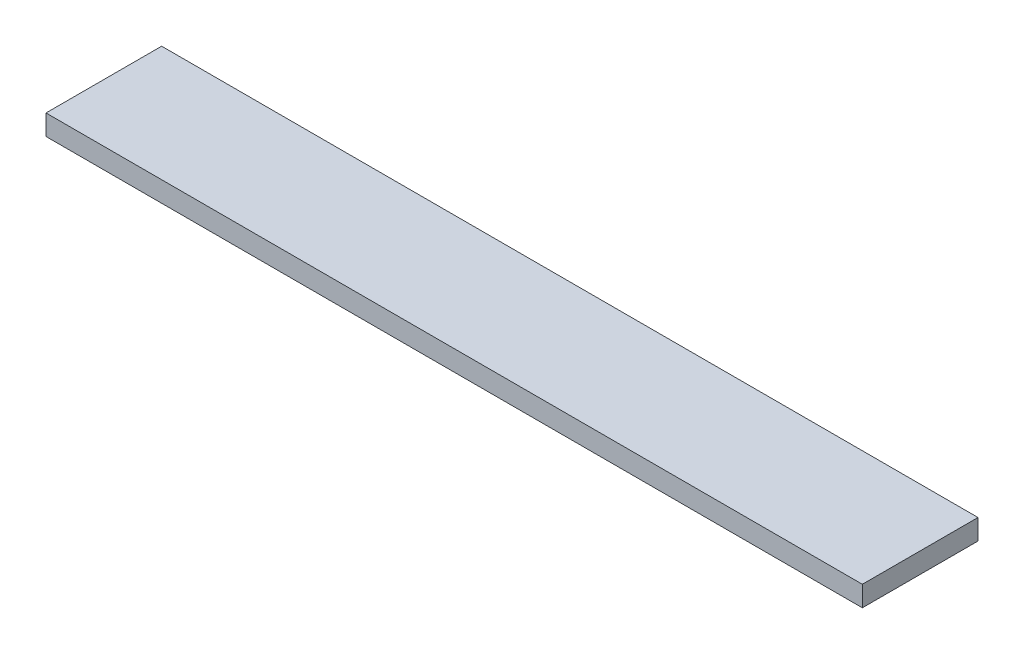
ISO-10303-21;
HEADER;
FILE_DESCRIPTION(('STEP AP214'),'2;1');
FILE_NAME('part.step','',(''),(''),'','','');
FILE_SCHEMA(('AUTOMOTIVE_DESIGN { 1 0 10303 214 1 1 1 1 }'));
ENDSEC;
DATA;
#1=APPLICATION_CONTEXT('core data for automotive mechanical design processes');
#2=APPLICATION_PROTOCOL_DEFINITION('international standard','automotive_design',2000,#1);
#3=PRODUCT_CONTEXT('',#1,'mechanical');
#4=PRODUCT('Part','Part','',(#3));
#5=PRODUCT_RELATED_PRODUCT_CATEGORY('part','',(#4));
#6=PRODUCT_DEFINITION_FORMATION('','',#4);
#7=PRODUCT_DEFINITION_CONTEXT('part definition',#1,'design');
#8=PRODUCT_DEFINITION('design','',#6,#7);
#9=PRODUCT_DEFINITION_SHAPE('','',#8);
#10=(LENGTH_UNIT() NAMED_UNIT(*) SI_UNIT(.MILLI.,.METRE.));
#11=(NAMED_UNIT(*) PLANE_ANGLE_UNIT() SI_UNIT($,.RADIAN.));
#12=(NAMED_UNIT(*) SI_UNIT($,.STERADIAN.) SOLID_ANGLE_UNIT());
#13=UNCERTAINTY_MEASURE_WITH_UNIT(LENGTH_MEASURE(1.E-05),#10,'distance_accuracy_value','');
#14=(GEOMETRIC_REPRESENTATION_CONTEXT(3) GLOBAL_UNCERTAINTY_ASSIGNED_CONTEXT((#13)) GLOBAL_UNIT_ASSIGNED_CONTEXT((#10,
#11,#12)) REPRESENTATION_CONTEXT('',''));
#15=CARTESIAN_POINT('',(0.,0.,0.));
#16=DIRECTION('',(0.,0.,1.));
#17=DIRECTION('',(1.,0.,0.));
#18=AXIS2_PLACEMENT_3D('',#15,#16,#17);
#19=CARTESIAN_POINT('',(-60.,3.,8.50000000000001));
#20=DIRECTION('',(1.,0.,0.));
#21=DIRECTION('',(0.,0.,-1.));
#22=AXIS2_PLACEMENT_3D('',#19,#20,#21);
#23=PLANE('',#22);
#24=DIRECTION('',(0.,0.,1.));
#25=VECTOR('',#24,1.);
#26=CARTESIAN_POINT('',(-60.,0.,8.50000000000001));
#27=LINE('',#26,#25);
#28=CARTESIAN_POINT('',(-60.,0.,-8.49999999999999));
#29=VERTEX_POINT('',#28);
#30=CARTESIAN_POINT('',(-60.,0.,8.50000000000001));
#31=VERTEX_POINT('',#30);
#32=EDGE_CURVE('E95',#29,#31,#27,.T.);
#33=ORIENTED_EDGE('',*,*,#32,.T.);
#34=DIRECTION('',(0.,-1.,0.));
#35=VECTOR('',#34,1.);
#36=CARTESIAN_POINT('',(-60.,3.,8.50000000000001));
#37=LINE('',#36,#35);
#38=CARTESIAN_POINT('',(-60.,3.,8.50000000000001));
#39=VERTEX_POINT('',#38);
#40=EDGE_CURVE('E11',#39,#31,#37,.T.);
#41=ORIENTED_EDGE('',*,*,#40,.F.);
#42=DIRECTION('',(0.,0.,1.));
#43=VECTOR('',#42,1.);
#44=CARTESIAN_POINT('',(-60.,3.,8.50000000000001));
#45=LINE('',#44,#43);
#46=CARTESIAN_POINT('',(-60.,3.,-8.49999999999999));
#47=VERTEX_POINT('',#46);
#48=EDGE_CURVE('E83',#47,#39,#45,.T.);
#49=ORIENTED_EDGE('',*,*,#48,.F.);
#50=DIRECTION('',(0.,-1.,0.));
#51=VECTOR('',#50,1.);
#52=CARTESIAN_POINT('',(-60.,3.,-8.49999999999999));
#53=LINE('',#52,#51);
#54=EDGE_CURVE('E91',#47,#29,#53,.T.);
#55=ORIENTED_EDGE('',*,*,#54,.T.);
#56=EDGE_LOOP('',(#33,#41,#49,#55));
#57=FACE_BOUND('',#56,.T.);
#58=ADVANCED_FACE('F32',(#57),#23,.F.);
#59=CARTESIAN_POINT('',(60.,3.,8.49999999999999));
#60=DIRECTION('',(0.,0.,-1.));
#61=DIRECTION('',(-1.,0.,0.));
#62=AXIS2_PLACEMENT_3D('',#59,#60,#61);
#63=PLANE('',#62);
#64=DIRECTION('',(1.,0.,0.));
#65=VECTOR('',#64,1.);
#66=CARTESIAN_POINT('',(60.,0.,8.49999999999999));
#67=LINE('',#66,#65);
#68=CARTESIAN_POINT('',(60.,0.,8.49999999999999));
#69=VERTEX_POINT('',#68);
#70=EDGE_CURVE('E87',#31,#69,#67,.T.);
#71=ORIENTED_EDGE('',*,*,#70,.T.);
#72=DIRECTION('',(0.,-1.,0.));
#73=VECTOR('',#72,1.);
#74=CARTESIAN_POINT('',(60.,3.,8.49999999999999));
#75=LINE('',#74,#73);
#76=CARTESIAN_POINT('',(60.,3.,8.49999999999999));
#77=VERTEX_POINT('',#76);
#78=EDGE_CURVE('E40',#77,#69,#75,.T.);
#79=ORIENTED_EDGE('',*,*,#78,.F.);
#80=DIRECTION('',(1.,0.,0.));
#81=VECTOR('',#80,1.);
#82=CARTESIAN_POINT('',(60.,3.,8.49999999999999));
#83=LINE('',#82,#81);
#84=EDGE_CURVE('E78',#39,#77,#83,.T.);
#85=ORIENTED_EDGE('',*,*,#84,.F.);
#86=ORIENTED_EDGE('',*,*,#40,.T.);
#87=EDGE_LOOP('',(#71,#79,#85,#86));
#88=FACE_BOUND('',#87,.T.);
#89=ADVANCED_FACE('F86',(#88),#63,.F.);
#90=CARTESIAN_POINT('',(60.,3.,8.49999999999999));
#91=DIRECTION('',(-1.,0.,0.));
#92=DIRECTION('',(0.,0.,1.));
#93=AXIS2_PLACEMENT_3D('',#90,#91,#92);
#94=PLANE('',#93);
#95=DIRECTION('',(0.,0.,-1.));
#96=VECTOR('',#95,1.);
#97=CARTESIAN_POINT('',(60.,0.,8.49999999999999));
#98=LINE('',#97,#96);
#99=CARTESIAN_POINT('',(60.,0.,-8.50000000000001));
#100=VERTEX_POINT('',#99);
#101=EDGE_CURVE('E65',#69,#100,#98,.T.);
#102=ORIENTED_EDGE('',*,*,#101,.T.);
#103=DIRECTION('',(0.,-1.,0.));
#104=VECTOR('',#103,1.);
#105=CARTESIAN_POINT('',(60.,3.,-8.50000000000001));
#106=LINE('',#105,#104);
#107=CARTESIAN_POINT('',(60.,3.,-8.50000000000001));
#108=VERTEX_POINT('',#107);
#109=EDGE_CURVE('E88',#108,#100,#106,.T.);
#110=ORIENTED_EDGE('',*,*,#109,.F.);
#111=DIRECTION('',(0.,0.,-1.));
#112=VECTOR('',#111,1.);
#113=CARTESIAN_POINT('',(60.,3.,8.49999999999999));
#114=LINE('',#113,#112);
#115=EDGE_CURVE('E81',#77,#108,#114,.T.);
#116=ORIENTED_EDGE('',*,*,#115,.F.);
#117=ORIENTED_EDGE('',*,*,#78,.T.);
#118=EDGE_LOOP('',(#102,#110,#116,#117));
#119=FACE_BOUND('',#118,.T.);
#120=ADVANCED_FACE('F89',(#119),#94,.F.);
#121=CARTESIAN_POINT('',(60.,3.,-8.50000000000001));
#122=DIRECTION('',(0.,0.,1.));
#123=DIRECTION('',(1.,0.,0.));
#124=AXIS2_PLACEMENT_3D('',#121,#122,#123);
#125=PLANE('',#124);
#126=DIRECTION('',(-1.,0.,0.));
#127=VECTOR('',#126,1.);
#128=CARTESIAN_POINT('',(60.,0.,-8.50000000000001));
#129=LINE('',#128,#127);
#130=EDGE_CURVE('E71',#100,#29,#129,.T.);
#131=ORIENTED_EDGE('',*,*,#130,.T.);
#132=ORIENTED_EDGE('',*,*,#54,.F.);
#133=DIRECTION('',(-1.,0.,0.));
#134=VECTOR('',#133,1.);
#135=CARTESIAN_POINT('',(60.,3.,-8.50000000000001));
#136=LINE('',#135,#134);
#137=EDGE_CURVE('E48',#108,#47,#136,.T.);
#138=ORIENTED_EDGE('',*,*,#137,.F.);
#139=ORIENTED_EDGE('',*,*,#109,.T.);
#140=EDGE_LOOP('',(#131,#132,#138,#139));
#141=FACE_BOUND('',#140,.T.);
#142=ADVANCED_FACE('F102',(#141),#125,.F.);
#143=CARTESIAN_POINT('',(0.,3.,0.));
#144=DIRECTION('',(0.,1.,0.));
#145=DIRECTION('',(0.,0.,1.));
#146=AXIS2_PLACEMENT_3D('',#143,#144,#145);
#147=PLANE('',#146);
#148=ORIENTED_EDGE('',*,*,#48,.T.);
#149=ORIENTED_EDGE('',*,*,#84,.T.);
#150=ORIENTED_EDGE('',*,*,#115,.T.);
#151=ORIENTED_EDGE('',*,*,#137,.T.);
#152=EDGE_LOOP('',(#148,#149,#150,#151));
#153=FACE_BOUND('',#152,.T.);
#154=ADVANCED_FACE('F79',(#153),#147,.T.);
#155=CARTESIAN_POINT('',(0.,0.,0.));
#156=DIRECTION('',(0.,1.,0.));
#157=DIRECTION('',(0.,0.,1.));
#158=AXIS2_PLACEMENT_3D('',#155,#156,#157);
#159=PLANE('',#158);
#160=ORIENTED_EDGE('',*,*,#32,.F.);
#161=ORIENTED_EDGE('',*,*,#130,.F.);
#162=ORIENTED_EDGE('',*,*,#101,.F.);
#163=ORIENTED_EDGE('',*,*,#70,.F.);
#164=EDGE_LOOP('',(#160,#161,#162,#163));
#165=FACE_BOUND('',#164,.T.);
#166=ADVANCED_FACE('F105',(#165),#159,.F.);
#167=CLOSED_SHELL('',(#58,#89,#120,#142,#154,#166));
#168=MANIFOLD_SOLID_BREP('B2',#167);
#169=ADVANCED_BREP_SHAPE_REPRESENTATION('',(#18,#168),#14);
#170=SHAPE_DEFINITION_REPRESENTATION(#9,#169);
ENDSEC;
END-ISO-10303-21;
